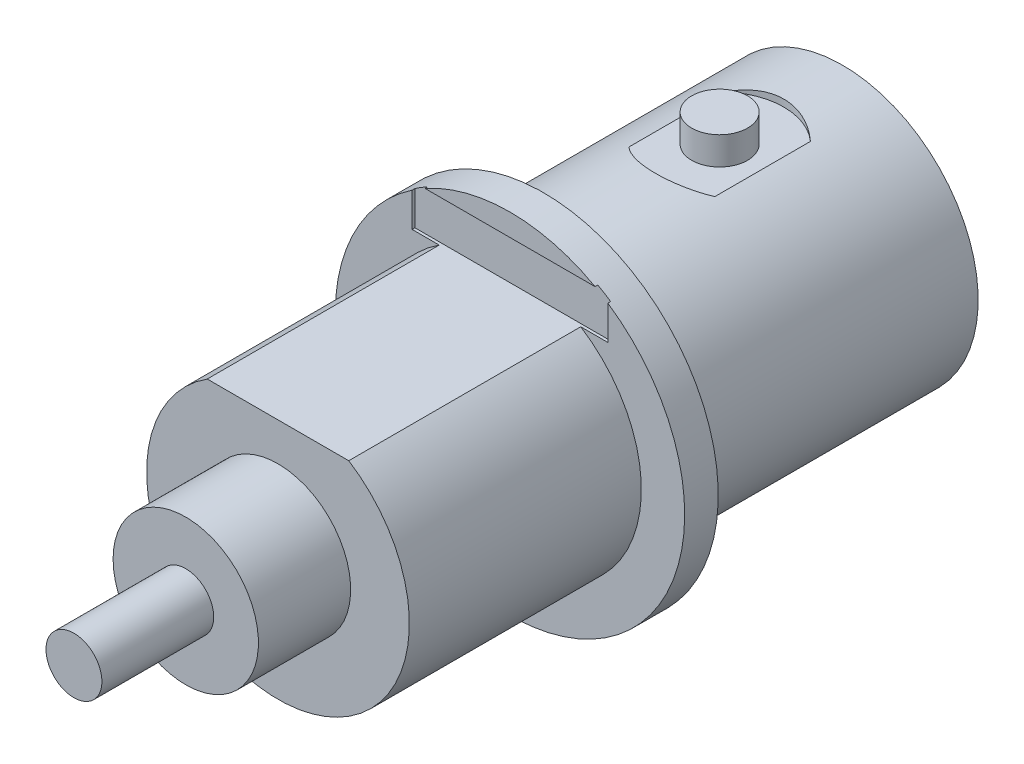
ISO-10303-21;
HEADER;
FILE_DESCRIPTION(('STEP AP214'),'2;1');
FILE_NAME('part.step','',(''),(''),'','','');
FILE_SCHEMA(('AUTOMOTIVE_DESIGN { 1 0 10303 214 1 1 1 1 }'));
ENDSEC;
DATA;
#1=APPLICATION_CONTEXT('core data for automotive mechanical design processes');
#2=APPLICATION_PROTOCOL_DEFINITION('international standard','automotive_design',2000,#1);
#3=PRODUCT_CONTEXT('',#1,'mechanical');
#4=PRODUCT('Part','Part','',(#3));
#5=PRODUCT_RELATED_PRODUCT_CATEGORY('part','',(#4));
#6=PRODUCT_DEFINITION_FORMATION('','',#4);
#7=PRODUCT_DEFINITION_CONTEXT('part definition',#1,'design');
#8=PRODUCT_DEFINITION('design','',#6,#7);
#9=PRODUCT_DEFINITION_SHAPE('','',#8);
#10=(LENGTH_UNIT() NAMED_UNIT(*) SI_UNIT(.MILLI.,.METRE.));
#11=(NAMED_UNIT(*) PLANE_ANGLE_UNIT() SI_UNIT($,.RADIAN.));
#12=(NAMED_UNIT(*) SI_UNIT($,.STERADIAN.) SOLID_ANGLE_UNIT());
#13=UNCERTAINTY_MEASURE_WITH_UNIT(LENGTH_MEASURE(1.E-05),#10,'distance_accuracy_value','');
#14=(GEOMETRIC_REPRESENTATION_CONTEXT(3) GLOBAL_UNCERTAINTY_ASSIGNED_CONTEXT((#13)) GLOBAL_UNIT_ASSIGNED_CONTEXT((#10,
#11,#12)) REPRESENTATION_CONTEXT('',''));
#15=CARTESIAN_POINT('',(0.,0.,0.));
#16=DIRECTION('',(0.,0.,1.));
#17=DIRECTION('',(1.,0.,0.));
#18=AXIS2_PLACEMENT_3D('',#15,#16,#17);
#19=CARTESIAN_POINT('',(0.,-4.6,4.4));
#20=DIRECTION('',(0.,-1.,0.));
#21=DIRECTION('',(-1.,0.,0.));
#22=AXIS2_PLACEMENT_3D('',#19,#20,#21);
#23=CYLINDRICAL_SURFACE('',#22,1.);
#24=CARTESIAN_POINT('',(0.,-5.6,4.4));
#25=DIRECTION('',(0.,1.,0.));
#26=DIRECTION('',(-1.,0.,0.));
#27=AXIS2_PLACEMENT_3D('',#24,#25,#26);
#28=CIRCLE('',#27,1.);
#29=CARTESIAN_POINT('',(-1.,-5.6,4.4));
#30=VERTEX_POINT('',#29);
#31=EDGE_CURVE('E11',#30,#30,#28,.T.);
#32=ORIENTED_EDGE('',*,*,#31,.T.);
#33=EDGE_LOOP('',(#32));
#34=FACE_BOUND('',#33,.T.);
#35=CARTESIAN_POINT('',(0.,-4.6,4.4));
#36=DIRECTION('',(0.,1.,0.));
#37=DIRECTION('',(-1.,0.,0.));
#38=AXIS2_PLACEMENT_3D('',#35,#36,#37);
#39=CIRCLE('',#38,1.);
#40=CARTESIAN_POINT('',(-1.,-4.6,4.4));
#41=VERTEX_POINT('',#40);
#42=EDGE_CURVE('E202',#41,#41,#39,.T.);
#43=ORIENTED_EDGE('',*,*,#42,.F.);
#44=EDGE_LOOP('',(#43));
#45=FACE_BOUND('',#44,.T.);
#46=ADVANCED_FACE('F17',(#34,#45),#23,.T.);
#47=CARTESIAN_POINT('',(0.,-5.6,4.4));
#48=DIRECTION('',(0.,1.,0.));
#49=DIRECTION('',(0.,0.,1.));
#50=AXIS2_PLACEMENT_3D('',#47,#48,#49);
#51=PLANE('',#50);
#52=ORIENTED_EDGE('',*,*,#31,.F.);
#53=EDGE_LOOP('',(#52));
#54=FACE_BOUND('',#53,.T.);
#55=ADVANCED_FACE('F331',(#54),#51,.F.);
#56=CARTESIAN_POINT('',(0.,4.6,4.4));
#57=DIRECTION('',(0.,1.,0.));
#58=DIRECTION('',(-1.,0.,0.));
#59=AXIS2_PLACEMENT_3D('',#56,#57,#58);
#60=CYLINDRICAL_SURFACE('',#59,1.);
#61=CARTESIAN_POINT('',(0.,5.6,4.4));
#62=DIRECTION('',(0.,-1.,0.));
#63=DIRECTION('',(-1.,0.,0.));
#64=AXIS2_PLACEMENT_3D('',#61,#62,#63);
#65=CIRCLE('',#64,1.);
#66=CARTESIAN_POINT('',(-1.,5.6,4.4));
#67=VERTEX_POINT('',#66);
#68=EDGE_CURVE('E31',#67,#67,#65,.T.);
#69=ORIENTED_EDGE('',*,*,#68,.T.);
#70=EDGE_LOOP('',(#69));
#71=FACE_BOUND('',#70,.T.);
#72=CARTESIAN_POINT('',(0.,4.6,4.4));
#73=DIRECTION('',(0.,-1.,0.));
#74=DIRECTION('',(-1.,0.,0.));
#75=AXIS2_PLACEMENT_3D('',#72,#73,#74);
#76=CIRCLE('',#75,1.);
#77=CARTESIAN_POINT('',(-1.,4.6,4.4));
#78=VERTEX_POINT('',#77);
#79=EDGE_CURVE('E211',#78,#78,#76,.T.);
#80=ORIENTED_EDGE('',*,*,#79,.F.);
#81=EDGE_LOOP('',(#80));
#82=FACE_BOUND('',#81,.T.);
#83=ADVANCED_FACE('F337',(#71,#82),#60,.T.);
#84=CARTESIAN_POINT('',(0.,5.6,4.4));
#85=DIRECTION('',(0.,-1.,0.));
#86=DIRECTION('',(0.,0.,-1.));
#87=AXIS2_PLACEMENT_3D('',#84,#85,#86);
#88=PLANE('',#87);
#89=ORIENTED_EDGE('',*,*,#68,.F.);
#90=EDGE_LOOP('',(#89));
#91=FACE_BOUND('',#90,.T.);
#92=ADVANCED_FACE('F343',(#91),#88,.F.);
#93=CARTESIAN_POINT('',(0.,-5.,4.4));
#94=DIRECTION('',(0.,1.,0.));
#95=DIRECTION('',(1.,0.,0.));
#96=AXIS2_PLACEMENT_3D('',#93,#94,#95);
#97=CYLINDRICAL_SURFACE('',#96,2.3);
#98=CARTESIAN_POINT('',(-1.53704261489394,-4.6,6.11099386322687));
#99=CARTESIAN_POINT('',(-1.4906298131567,-4.61550891309749,6.15268182455969));
#100=CARTESIAN_POINT('',(-1.44250589234814,-4.63080657242072,6.19250512185041));
#101=CARTESIAN_POINT('',(-1.34300705799123,-4.66063667431046,6.26822125569124));
#102=CARTESIAN_POINT('',(-1.29163088762436,-4.67516881702227,6.30411255792612));
#103=CARTESIAN_POINT('',(-1.13269629796707,-4.71714811789734,6.4056940005494));
#104=CARTESIAN_POINT('',(-1.02054507502494,-4.74290425891573,6.4650996222041));
#105=CARTESIAN_POINT('',(-0.786447672910064,-4.78729916609794,6.56512228438405));
#106=CARTESIAN_POINT('',(-0.664474254287195,-4.80591725219317,6.6056848042722));
#107=CARTESIAN_POINT('',(-0.414633540399089,-4.83387146918193,6.66595097481931));
#108=CARTESIAN_POINT('',(-0.286778229523473,-4.84322566888756,6.68569523548452));
#109=CARTESIAN_POINT('',(-0.0374878723374627,-4.85135615397962,6.70286857434512));
#110=CARTESIAN_POINT('',(0.0838353555363709,-4.8507701854694,6.70164299919057));
#111=CARTESIAN_POINT('',(0.32445743599385,-4.84063306663373,6.6802012795501));
#112=CARTESIAN_POINT('',(0.443755436573453,-4.83107823386259,6.65997733469097));
#113=CARTESIAN_POINT('',(0.673633655235687,-4.80434860687774,6.6022475960525));
#114=CARTESIAN_POINT('',(0.784362874325871,-4.78738865333914,6.56522797978869));
#115=CARTESIAN_POINT('',(0.998044777560692,-4.74744343575194,6.47541147263036));
#116=CARTESIAN_POINT('',(1.10099808851902,-4.72445865803183,6.4226158551388));
#117=CARTESIAN_POINT('',(1.25937247227696,-4.68405563714825,6.32587532828797));
#118=CARTESIAN_POINT('',(1.31786025605898,-4.66789084491859,6.28632138488218));
#119=CARTESIAN_POINT('',(1.43063030303366,-4.63457117644841,6.20228264866359));
#120=CARTESIAN_POINT('',(1.48492309675131,-4.61741898137366,6.15781093231778));
#121=CARTESIAN_POINT('',(1.53704261489394,-4.6,6.11099386322687));
#122=B_SPLINE_CURVE_WITH_KNOTS('',3,(#98,#99,#100,#101,#102,#103,#104,#105,#106,#107,#108,#109,
#110,#111,#112,#113,#114,#115,#116,#117,#118,#119,#120,#121),.UNSPECIFIED.,.F.,.F.,(4,2,2,2,2,2,
2,2,2,2,2,4),(0.,0.192751603086855,0.385578154429104,0.772109918951271,1.15975321368593,
1.54663892892574,1.90880212986845,2.27111409322923,2.62354853091461,2.97595452857423,
3.19298541062174,3.40945248248997),.UNSPECIFIED.);
#123=CARTESIAN_POINT('',(-1.53704261489394,-4.6,6.11099386322687));
#124=VERTEX_POINT('',#123);
#125=CARTESIAN_POINT('',(1.53704261489394,-4.6,6.11099386322687));
#126=VERTEX_POINT('',#125);
#127=EDGE_CURVE('E39',#124,#126,#122,.T.);
#128=ORIENTED_EDGE('',*,*,#127,.F.);
#129=CARTESIAN_POINT('',(0.,-4.6,4.4));
#130=DIRECTION('',(0.,-1.,0.));
#131=DIRECTION('',(1.,0.,0.));
#132=AXIS2_PLACEMENT_3D('',#129,#130,#131);
#133=CIRCLE('',#132,2.3);
#134=EDGE_CURVE('E189',#126,#124,#133,.T.);
#135=ORIENTED_EDGE('',*,*,#134,.F.);
#136=EDGE_LOOP('',(#128,#135));
#137=FACE_BOUND('',#136,.T.);
#138=ADVANCED_FACE('F221',(#137),#97,.F.);
#139=CARTESIAN_POINT('',(0.,-5.,4.4));
#140=DIRECTION('',(0.,1.,0.));
#141=DIRECTION('',(1.,0.,0.));
#142=AXIS2_PLACEMENT_3D('',#139,#140,#141);
#143=CYLINDRICAL_SURFACE('',#142,2.3);
#144=CARTESIAN_POINT('',(1.53704261489394,-4.6,2.68900613677313));
#145=CARTESIAN_POINT('',(1.4906298131567,-4.61550891309749,2.64731817544031));
#146=CARTESIAN_POINT('',(1.44250589234814,-4.63080657242072,2.60749487814959));
#147=CARTESIAN_POINT('',(1.34300705799123,-4.66063667431046,2.53177874430876));
#148=CARTESIAN_POINT('',(1.29163088762436,-4.67516881702227,2.49588744207388));
#149=CARTESIAN_POINT('',(1.13269629796707,-4.71714811789734,2.3943059994506));
#150=CARTESIAN_POINT('',(1.02054507502494,-4.74290425891573,2.3349003777959));
#151=CARTESIAN_POINT('',(0.786447672910065,-4.78729916609794,2.23487771561595));
#152=CARTESIAN_POINT('',(0.664474254287195,-4.80591725219317,2.1943151957278));
#153=CARTESIAN_POINT('',(0.414633540399089,-4.83387146918193,2.13404902518069));
#154=CARTESIAN_POINT('',(0.286778229523474,-4.84322566888756,2.11430476451548));
#155=CARTESIAN_POINT('',(0.0374878723374628,-4.85135615397962,2.09713142565488));
#156=CARTESIAN_POINT('',(-0.0838353555363708,-4.8507701854694,2.09835700080943));
#157=CARTESIAN_POINT('',(-0.324457435993849,-4.84063306663373,2.1197987204499));
#158=CARTESIAN_POINT('',(-0.443755436573453,-4.83107823386259,2.14002266530903));
#159=CARTESIAN_POINT('',(-0.673633655235686,-4.80434860687774,2.1977524039475));
#160=CARTESIAN_POINT('',(-0.784362874325871,-4.78738865333914,2.23477202021131));
#161=CARTESIAN_POINT('',(-0.998044777560692,-4.74744343575194,2.32458852736964));
#162=CARTESIAN_POINT('',(-1.10099808851902,-4.72445865803183,2.3773841448612));
#163=CARTESIAN_POINT('',(-1.25937247227696,-4.68405563714825,2.47412467171203));
#164=CARTESIAN_POINT('',(-1.31786025605898,-4.66789084491859,2.51367861511782));
#165=CARTESIAN_POINT('',(-1.43063030303366,-4.63457117644841,2.59771735133641));
#166=CARTESIAN_POINT('',(-1.48492309675131,-4.61741898137366,2.64218906768222));
#167=CARTESIAN_POINT('',(-1.53704261489394,-4.6,2.68900613677313));
#168=B_SPLINE_CURVE_WITH_KNOTS('',3,(#144,#145,#146,#147,#148,#149,#150,#151,#152,#153,#154,
#155,#156,#157,#158,#159,#160,#161,#162,#163,#164,#165,#166,#167),.UNSPECIFIED.,.F.,.F.,(4,2,2,
2,2,2,2,2,2,2,2,4),(0.,0.192751603086855,0.385578154429104,0.772109918951271,1.15975321368593,
1.54663892892574,1.90880212986845,2.27111409322923,2.62354853091461,2.97595452857423,
3.19298541062174,3.40945248248997),.UNSPECIFIED.);
#169=CARTESIAN_POINT('',(1.53704261489394,-4.6,2.68900613677313));
#170=VERTEX_POINT('',#169);
#171=CARTESIAN_POINT('',(-1.53704261489394,-4.6,2.68900613677313));
#172=VERTEX_POINT('',#171);
#173=EDGE_CURVE('E195',#170,#172,#168,.T.);
#174=ORIENTED_EDGE('',*,*,#173,.F.);
#175=CARTESIAN_POINT('',(0.,-4.6,4.4));
#176=DIRECTION('',(0.,-1.,0.));
#177=DIRECTION('',(1.,0.,0.));
#178=AXIS2_PLACEMENT_3D('',#175,#176,#177);
#179=CIRCLE('',#178,2.3);
#180=EDGE_CURVE('E191',#172,#170,#179,.T.);
#181=ORIENTED_EDGE('',*,*,#180,.F.);
#182=EDGE_LOOP('',(#174,#181));
#183=FACE_BOUND('',#182,.T.);
#184=ADVANCED_FACE('F350',(#183),#143,.F.);
#185=CARTESIAN_POINT('',(0.,-4.6,4.4));
#186=DIRECTION('',(0.,-1.,0.));
#187=DIRECTION('',(0.,0.,-1.));
#188=AXIS2_PLACEMENT_3D('',#185,#186,#187);
#189=PLANE('',#188);
#190=DIRECTION('',(0.,0.,-1.));
#191=VECTOR('',#190,1.);
#192=CARTESIAN_POINT('',(1.53704261489394,-4.6,6.11099386322687));
#193=LINE('',#192,#191);
#194=EDGE_CURVE('E197',#126,#170,#193,.T.);
#195=ORIENTED_EDGE('',*,*,#194,.F.);
#196=ORIENTED_EDGE('',*,*,#134,.T.);
#197=DIRECTION('',(0.,0.,1.));
#198=VECTOR('',#197,1.);
#199=CARTESIAN_POINT('',(-1.53704261489394,-4.6,2.68900613677313));
#200=LINE('',#199,#198);
#201=EDGE_CURVE('E192',#172,#124,#200,.T.);
#202=ORIENTED_EDGE('',*,*,#201,.F.);
#203=ORIENTED_EDGE('',*,*,#180,.T.);
#204=EDGE_LOOP('',(#195,#196,#202,#203));
#205=FACE_BOUND('',#204,.T.);
#206=ORIENTED_EDGE('',*,*,#42,.T.);
#207=EDGE_LOOP('',(#206));
#208=FACE_BOUND('',#207,.T.);
#209=ADVANCED_FACE('F243',(#205,#208),#189,.T.);
#210=CARTESIAN_POINT('',(0.,5.,4.4));
#211=DIRECTION('',(0.,-1.,0.));
#212=DIRECTION('',(1.,0.,0.));
#213=AXIS2_PLACEMENT_3D('',#210,#211,#212);
#214=CYLINDRICAL_SURFACE('',#213,2.3);
#215=CARTESIAN_POINT('',(1.53704261489394,4.6,6.11099386322687));
#216=CARTESIAN_POINT('',(1.4906298131567,4.61550891309749,6.15268182455969));
#217=CARTESIAN_POINT('',(1.44250589234814,4.63080657242072,6.19250512185042));
#218=CARTESIAN_POINT('',(1.34300705799123,4.66063667431046,6.26822125569124));
#219=CARTESIAN_POINT('',(1.29163088762436,4.67516881702227,6.30411255792612));
#220=CARTESIAN_POINT('',(1.13269629796707,4.71714811789734,6.4056940005494));
#221=CARTESIAN_POINT('',(1.02054507502494,4.74290425891572,6.4650996222041));
#222=CARTESIAN_POINT('',(0.786447672910064,4.78729916609794,6.56512228438405));
#223=CARTESIAN_POINT('',(0.664474254287194,4.80591725219317,6.6056848042722));
#224=CARTESIAN_POINT('',(0.414633540399088,4.83387146918193,6.66595097481931));
#225=CARTESIAN_POINT('',(0.286778229523473,4.84322566888756,6.68569523548452));
#226=CARTESIAN_POINT('',(0.0374878723374619,4.85135615397962,6.70286857434512));
#227=CARTESIAN_POINT('',(-0.0838353555363716,4.8507701854694,6.70164299919057));
#228=CARTESIAN_POINT('',(-0.32445743599385,4.84063306663373,6.6802012795501));
#229=CARTESIAN_POINT('',(-0.443755436573454,4.83107823386259,6.65997733469097));
#230=CARTESIAN_POINT('',(-0.673633655235687,4.80434860687774,6.6022475960525));
#231=CARTESIAN_POINT('',(-0.784362874325872,4.78738865333914,6.56522797978869));
#232=CARTESIAN_POINT('',(-0.998044777560693,4.74744343575194,6.47541147263036));
#233=CARTESIAN_POINT('',(-1.10099808851902,4.72445865803183,6.4226158551388));
#234=CARTESIAN_POINT('',(-1.25937247227696,4.68405563714825,6.32587532828797));
#235=CARTESIAN_POINT('',(-1.31786025605898,4.66789084491859,6.28632138488218));
#236=CARTESIAN_POINT('',(-1.43063030303366,4.63457117644841,6.20228264866359));
#237=CARTESIAN_POINT('',(-1.48492309675131,4.61741898137366,6.15781093231778));
#238=CARTESIAN_POINT('',(-1.53704261489394,4.6,6.11099386322687));
#239=B_SPLINE_CURVE_WITH_KNOTS('',3,(#215,#216,#217,#218,#219,#220,#221,#222,#223,#224,#225,
#226,#227,#228,#229,#230,#231,#232,#233,#234,#235,#236,#237,#238),.UNSPECIFIED.,.F.,.F.,(4,2,2,
2,2,2,2,2,2,2,2,4),(0.,0.192751603086855,0.385578154429103,0.772109918951271,1.15975321368593,
1.54663892892574,1.90880212986845,2.27111409322923,2.62354853091461,2.97595452857423,
3.19298541062174,3.40945248248997),.UNSPECIFIED.);
#240=CARTESIAN_POINT('',(1.53704261489394,4.6,6.11099386322687));
#241=VERTEX_POINT('',#240);
#242=CARTESIAN_POINT('',(-1.53704261489394,4.6,6.11099386322687));
#243=VERTEX_POINT('',#242);
#244=EDGE_CURVE('E196',#241,#243,#239,.T.);
#245=ORIENTED_EDGE('',*,*,#244,.F.);
#246=CARTESIAN_POINT('',(0.,4.6,4.4));
#247=DIRECTION('',(0.,1.,0.));
#248=DIRECTION('',(1.,0.,0.));
#249=AXIS2_PLACEMENT_3D('',#246,#247,#248);
#250=CIRCLE('',#249,2.3);
#251=EDGE_CURVE('E203',#243,#241,#250,.T.);
#252=ORIENTED_EDGE('',*,*,#251,.F.);
#253=EDGE_LOOP('',(#245,#252));
#254=FACE_BOUND('',#253,.T.);
#255=ADVANCED_FACE('F238',(#254),#214,.F.);
#256=CARTESIAN_POINT('',(0.,5.,4.4));
#257=DIRECTION('',(0.,-1.,0.));
#258=DIRECTION('',(1.,0.,0.));
#259=AXIS2_PLACEMENT_3D('',#256,#257,#258);
#260=CYLINDRICAL_SURFACE('',#259,2.3);
#261=CARTESIAN_POINT('',(-1.53704261489394,4.6,2.68900613677313));
#262=CARTESIAN_POINT('',(-1.4906298131567,4.61550891309749,2.64731817544031));
#263=CARTESIAN_POINT('',(-1.44250589234814,4.63080657242072,2.60749487814959));
#264=CARTESIAN_POINT('',(-1.34300705799123,4.66063667431046,2.53177874430876));
#265=CARTESIAN_POINT('',(-1.29163088762436,4.67516881702227,2.49588744207388));
#266=CARTESIAN_POINT('',(-1.13269629796707,4.71714811789733,2.3943059994506));
#267=CARTESIAN_POINT('',(-1.02054507502494,4.74290425891572,2.3349003777959));
#268=CARTESIAN_POINT('',(-0.786447672910064,4.78729916609794,2.23487771561596));
#269=CARTESIAN_POINT('',(-0.664474254287195,4.80591725219317,2.1943151957278));
#270=CARTESIAN_POINT('',(-0.414633540399088,4.83387146918193,2.13404902518069));
#271=CARTESIAN_POINT('',(-0.286778229523473,4.84322566888756,2.11430476451548));
#272=CARTESIAN_POINT('',(-0.0374878723374624,4.85135615397962,2.09713142565488));
#273=CARTESIAN_POINT('',(0.0838353555363711,4.8507701854694,2.09835700080943));
#274=CARTESIAN_POINT('',(0.32445743599385,4.84063306663373,2.1197987204499));
#275=CARTESIAN_POINT('',(0.443755436573453,4.83107823386259,2.14002266530903));
#276=CARTESIAN_POINT('',(0.673633655235687,4.80434860687774,2.1977524039475));
#277=CARTESIAN_POINT('',(0.784362874325871,4.78738865333914,2.23477202021131));
#278=CARTESIAN_POINT('',(0.998044777560692,4.74744343575194,2.32458852736964));
#279=CARTESIAN_POINT('',(1.10099808851902,4.72445865803183,2.3773841448612));
#280=CARTESIAN_POINT('',(1.25937247227695,4.68405563714825,2.47412467171203));
#281=CARTESIAN_POINT('',(1.31786025605898,4.66789084491859,2.51367861511782));
#282=CARTESIAN_POINT('',(1.43063030303366,4.63457117644841,2.59771735133641));
#283=CARTESIAN_POINT('',(1.48492309675131,4.61741898137366,2.64218906768222));
#284=CARTESIAN_POINT('',(1.53704261489394,4.6,2.68900613677313));
#285=B_SPLINE_CURVE_WITH_KNOTS('',3,(#261,#262,#263,#264,#265,#266,#267,#268,#269,#270,#271,
#272,#273,#274,#275,#276,#277,#278,#279,#280,#281,#282,#283,#284),.UNSPECIFIED.,.F.,.F.,(4,2,2,
2,2,2,2,2,2,2,2,4),(0.,0.192751603086855,0.385578154429104,0.772109918951271,1.15975321368593,
1.54663892892574,1.90880212986845,2.27111409322923,2.62354853091461,2.97595452857423,
3.19298541062174,3.40945248248997),.UNSPECIFIED.);
#286=CARTESIAN_POINT('',(-1.53704261489394,4.6,2.68900613677314));
#287=VERTEX_POINT('',#286);
#288=CARTESIAN_POINT('',(1.53704261489394,4.6,2.68900613677314));
#289=VERTEX_POINT('',#288);
#290=EDGE_CURVE('E21',#287,#289,#285,.T.);
#291=ORIENTED_EDGE('',*,*,#290,.F.);
#292=CARTESIAN_POINT('',(0.,4.6,4.4));
#293=DIRECTION('',(0.,1.,0.));
#294=DIRECTION('',(1.,0.,0.));
#295=AXIS2_PLACEMENT_3D('',#292,#293,#294);
#296=CIRCLE('',#295,2.3);
#297=EDGE_CURVE('E206',#289,#287,#296,.T.);
#298=ORIENTED_EDGE('',*,*,#297,.F.);
#299=EDGE_LOOP('',(#291,#298));
#300=FACE_BOUND('',#299,.T.);
#301=ADVANCED_FACE('F242',(#300),#260,.F.);
#302=CARTESIAN_POINT('',(0.,4.6,4.4));
#303=DIRECTION('',(0.,-1.,0.));
#304=DIRECTION('',(0.,0.,-1.));
#305=AXIS2_PLACEMENT_3D('',#302,#303,#304);
#306=PLANE('',#305);
#307=DIRECTION('',(0.,0.,-1.));
#308=VECTOR('',#307,1.);
#309=CARTESIAN_POINT('',(-1.53704261489394,4.6,6.11099386322687));
#310=LINE('',#309,#308);
#311=EDGE_CURVE('E208',#243,#287,#310,.T.);
#312=ORIENTED_EDGE('',*,*,#311,.F.);
#313=ORIENTED_EDGE('',*,*,#251,.T.);
#314=DIRECTION('',(0.,0.,1.));
#315=VECTOR('',#314,1.);
#316=CARTESIAN_POINT('',(1.53704261489394,4.6,2.68900613677313));
#317=LINE('',#316,#315);
#318=EDGE_CURVE('E188',#289,#241,#317,.T.);
#319=ORIENTED_EDGE('',*,*,#318,.F.);
#320=ORIENTED_EDGE('',*,*,#297,.T.);
#321=EDGE_LOOP('',(#312,#313,#319,#320));
#322=FACE_BOUND('',#321,.T.);
#323=ORIENTED_EDGE('',*,*,#79,.T.);
#324=EDGE_LOOP('',(#323));
#325=FACE_BOUND('',#324,.T.);
#326=ADVANCED_FACE('F248',(#322,#325),#306,.F.);
#327=CARTESIAN_POINT('',(-3.5,3.96,20.2));
#328=DIRECTION('',(0.,-1.,0.));
#329=DIRECTION('',(0.,0.,-1.));
#330=AXIS2_PLACEMENT_3D('',#327,#328,#329);
#331=PLANE('',#330);
#332=DIRECTION('',(0.,0.,-1.));
#333=VECTOR('',#332,1.);
#334=CARTESIAN_POINT('',(-2.53148177951175,3.96,20.2));
#335=LINE('',#334,#333);
#336=CARTESIAN_POINT('',(-2.53148177951175,3.96,20.2));
#337=VERTEX_POINT('',#336);
#338=CARTESIAN_POINT('',(-2.53148177951175,3.96,11.9));
#339=VERTEX_POINT('',#338);
#340=EDGE_CURVE('E358',#337,#339,#335,.T.);
#341=ORIENTED_EDGE('',*,*,#340,.F.);
#342=DIRECTION('',(-1.,0.,0.));
#343=VECTOR('',#342,1.);
#344=CARTESIAN_POINT('',(2.53148177951175,3.96,20.2));
#345=LINE('',#344,#343);
#346=CARTESIAN_POINT('',(2.53148177951175,3.96,20.2));
#347=VERTEX_POINT('',#346);
#348=EDGE_CURVE('E73',#347,#337,#345,.T.);
#349=ORIENTED_EDGE('',*,*,#348,.F.);
#350=DIRECTION('',(0.,0.,1.));
#351=VECTOR('',#350,1.);
#352=CARTESIAN_POINT('',(2.53148177951175,3.96,11.9));
#353=LINE('',#352,#351);
#354=CARTESIAN_POINT('',(2.53148177951175,3.96,11.9));
#355=VERTEX_POINT('',#354);
#356=EDGE_CURVE('E362',#355,#347,#353,.T.);
#357=ORIENTED_EDGE('',*,*,#356,.F.);
#358=DIRECTION('',(-1.,0.,0.));
#359=VECTOR('',#358,1.);
#360=CARTESIAN_POINT('',(3.5,3.96,11.9));
#361=LINE('',#360,#359);
#362=CARTESIAN_POINT('',(3.5,3.96,11.9));
#363=VERTEX_POINT('',#362);
#364=EDGE_CURVE('E133',#363,#355,#361,.T.);
#365=ORIENTED_EDGE('',*,*,#364,.F.);
#366=DIRECTION('',(0.,0.,-1.));
#367=VECTOR('',#366,1.);
#368=CARTESIAN_POINT('',(3.5,3.96,11.9));
#369=LINE('',#368,#367);
#370=CARTESIAN_POINT('',(3.5,3.96,11.8));
#371=VERTEX_POINT('',#370);
#372=EDGE_CURVE('E129',#363,#371,#369,.T.);
#373=ORIENTED_EDGE('',*,*,#372,.T.);
#374=DIRECTION('',(1.,0.,0.));
#375=VECTOR('',#374,1.);
#376=CARTESIAN_POINT('',(-3.5,3.96,11.8));
#377=LINE('',#376,#375);
#378=CARTESIAN_POINT('',(-3.5,3.96,11.8));
#379=VERTEX_POINT('',#378);
#380=EDGE_CURVE('E370',#379,#371,#377,.T.);
#381=ORIENTED_EDGE('',*,*,#380,.F.);
#382=DIRECTION('',(0.,0.,-1.));
#383=VECTOR('',#382,1.);
#384=CARTESIAN_POINT('',(-3.5,3.96,11.9));
#385=LINE('',#384,#383);
#386=CARTESIAN_POINT('',(-3.5,3.96,11.9));
#387=VERTEX_POINT('',#386);
#388=EDGE_CURVE('E369',#387,#379,#385,.T.);
#389=ORIENTED_EDGE('',*,*,#388,.F.);
#390=DIRECTION('',(-1.,0.,0.));
#391=VECTOR('',#390,1.);
#392=CARTESIAN_POINT('',(-2.53148177951175,3.96,11.9));
#393=LINE('',#392,#391);
#394=EDGE_CURVE('E144',#339,#387,#393,.T.);
#395=ORIENTED_EDGE('',*,*,#394,.F.);
#396=EDGE_LOOP('',(#341,#349,#357,#365,#373,#381,#389,#395));
#397=FACE_BOUND('',#396,.T.);
#398=ADVANCED_FACE('F251',(#397),#331,.F.);
#399=CARTESIAN_POINT('',(-3.5,5.46,20.2));
#400=DIRECTION('',(-1.,0.,0.));
#401=DIRECTION('',(0.,0.,1.));
#402=AXIS2_PLACEMENT_3D('',#399,#400,#401);
#403=PLANE('',#402);
#404=DIRECTION('',(0.,1.,0.));
#405=VECTOR('',#404,1.);
#406=CARTESIAN_POINT('',(-3.5,3.96,11.9));
#407=LINE('',#406,#405);
#408=CARTESIAN_POINT('',(-3.5,5.17807879430199,11.9));
#409=VERTEX_POINT('',#408);
#410=EDGE_CURVE('E132',#387,#409,#407,.T.);
#411=ORIENTED_EDGE('',*,*,#410,.F.);
#412=ORIENTED_EDGE('',*,*,#388,.T.);
#413=DIRECTION('',(0.,-1.,0.));
#414=VECTOR('',#413,1.);
#415=CARTESIAN_POINT('',(-3.5,5.17807879430199,11.8));
#416=LINE('',#415,#414);
#417=CARTESIAN_POINT('',(-3.5,5.17807879430199,11.8));
#418=VERTEX_POINT('',#417);
#419=EDGE_CURVE('E372',#418,#379,#416,.T.);
#420=ORIENTED_EDGE('',*,*,#419,.F.);
#421=DIRECTION('',(0.,0.,-1.));
#422=VECTOR('',#421,1.);
#423=CARTESIAN_POINT('',(-3.5,5.17807879430199,11.9));
#424=LINE('',#423,#422);
#425=EDGE_CURVE('E380',#409,#418,#424,.T.);
#426=ORIENTED_EDGE('',*,*,#425,.F.);
#427=EDGE_LOOP('',(#411,#412,#420,#426));
#428=FACE_BOUND('',#427,.T.);
#429=ADVANCED_FACE('F255',(#428),#403,.F.);
#430=CARTESIAN_POINT('',(3.5,5.46,20.2));
#431=DIRECTION('',(0.,1.,0.));
#432=DIRECTION('',(0.,0.,1.));
#433=AXIS2_PLACEMENT_3D('',#430,#431,#432);
#434=PLANE('',#433);
#435=DIRECTION('',(0.,0.,1.));
#436=VECTOR('',#435,1.);
#437=CARTESIAN_POINT('',(-3.04152922063885,5.46,11.8));
#438=LINE('',#437,#436);
#439=CARTESIAN_POINT('',(-3.04152922063885,5.46,11.8));
#440=VERTEX_POINT('',#439);
#441=CARTESIAN_POINT('',(-3.04152922063885,5.46,11.9));
#442=VERTEX_POINT('',#441);
#443=EDGE_CURVE('E383',#440,#442,#438,.T.);
#444=ORIENTED_EDGE('',*,*,#443,.F.);
#445=DIRECTION('',(-1.,0.,0.));
#446=VECTOR('',#445,1.);
#447=CARTESIAN_POINT('',(3.04152922063885,5.46,11.8));
#448=LINE('',#447,#446);
#449=CARTESIAN_POINT('',(3.04152922063885,5.46,11.8));
#450=VERTEX_POINT('',#449);
#451=EDGE_CURVE('E361',#450,#440,#448,.T.);
#452=ORIENTED_EDGE('',*,*,#451,.F.);
#453=DIRECTION('',(0.,0.,-1.));
#454=VECTOR('',#453,1.);
#455=CARTESIAN_POINT('',(3.04152922063885,5.46,11.9));
#456=LINE('',#455,#454);
#457=CARTESIAN_POINT('',(3.04152922063885,5.46,11.9));
#458=VERTEX_POINT('',#457);
#459=EDGE_CURVE('E388',#458,#450,#456,.T.);
#460=ORIENTED_EDGE('',*,*,#459,.F.);
#461=DIRECTION('',(1.,0.,0.));
#462=VECTOR('',#461,1.);
#463=CARTESIAN_POINT('',(-3.04152922063885,5.46,11.9));
#464=LINE('',#463,#462);
#465=EDGE_CURVE('E142',#442,#458,#464,.T.);
#466=ORIENTED_EDGE('',*,*,#465,.F.);
#467=EDGE_LOOP('',(#444,#452,#460,#466));
#468=FACE_BOUND('',#467,.T.);
#469=ADVANCED_FACE('F259',(#468),#434,.F.);
#470=CARTESIAN_POINT('',(0.,4.71,11.8));
#471=DIRECTION('',(0.,0.,1.));
#472=DIRECTION('',(1.,0.,0.));
#473=AXIS2_PLACEMENT_3D('',#470,#471,#472);
#474=PLANE('',#473);
#475=CARTESIAN_POINT('',(0.,0.,11.8));
#476=DIRECTION('',(0.,0.,-1.));
#477=DIRECTION('',(-1.,0.,0.));
#478=AXIS2_PLACEMENT_3D('',#475,#476,#477);
#479=CIRCLE('',#478,6.25);
#480=EDGE_CURVE('E382',#418,#440,#479,.T.);
#481=ORIENTED_EDGE('',*,*,#480,.F.);
#482=ORIENTED_EDGE('',*,*,#419,.T.);
#483=ORIENTED_EDGE('',*,*,#380,.T.);
#484=DIRECTION('',(0.,1.,0.));
#485=VECTOR('',#484,1.);
#486=CARTESIAN_POINT('',(3.5,3.96,11.8));
#487=LINE('',#486,#485);
#488=CARTESIAN_POINT('',(3.5,5.17807879430199,11.8));
#489=VERTEX_POINT('',#488);
#490=EDGE_CURVE('E373',#371,#489,#487,.T.);
#491=ORIENTED_EDGE('',*,*,#490,.T.);
#492=CARTESIAN_POINT('',(0.,0.,11.8));
#493=DIRECTION('',(0.,0.,-1.));
#494=DIRECTION('',(-1.,0.,0.));
#495=AXIS2_PLACEMENT_3D('',#492,#493,#494);
#496=CIRCLE('',#495,6.25);
#497=EDGE_CURVE('E117',#450,#489,#496,.T.);
#498=ORIENTED_EDGE('',*,*,#497,.F.);
#499=ORIENTED_EDGE('',*,*,#451,.T.);
#500=EDGE_LOOP('',(#481,#482,#483,#491,#498,#499));
#501=FACE_BOUND('',#500,.T.);
#502=ADVANCED_FACE('F263',(#501),#474,.T.);
#503=CARTESIAN_POINT('',(3.5,3.96,20.2));
#504=DIRECTION('',(1.,0.,0.));
#505=DIRECTION('',(0.,0.,-1.));
#506=AXIS2_PLACEMENT_3D('',#503,#504,#505);
#507=PLANE('',#506);
#508=DIRECTION('',(0.,-1.,0.));
#509=VECTOR('',#508,1.);
#510=CARTESIAN_POINT('',(3.5,5.17807879430199,11.9));
#511=LINE('',#510,#509);
#512=CARTESIAN_POINT('',(3.5,5.17807879430199,11.9));
#513=VERTEX_POINT('',#512);
#514=EDGE_CURVE('E124',#513,#363,#511,.T.);
#515=ORIENTED_EDGE('',*,*,#514,.F.);
#516=DIRECTION('',(0.,0.,1.));
#517=VECTOR('',#516,1.);
#518=CARTESIAN_POINT('',(3.5,5.17807879430199,11.8));
#519=LINE('',#518,#517);
#520=EDGE_CURVE('E127',#489,#513,#519,.T.);
#521=ORIENTED_EDGE('',*,*,#520,.F.);
#522=ORIENTED_EDGE('',*,*,#490,.F.);
#523=ORIENTED_EDGE('',*,*,#372,.F.);
#524=EDGE_LOOP('',(#515,#521,#522,#523));
#525=FACE_BOUND('',#524,.T.);
#526=ADVANCED_FACE('F125',(#525),#507,.F.);
#527=CARTESIAN_POINT('',(0.,0.,11.9));
#528=DIRECTION('',(0.,0.,1.));
#529=DIRECTION('',(-1.,0.,0.));
#530=AXIS2_PLACEMENT_3D('',#527,#528,#529);
#531=CYLINDRICAL_SURFACE('',#530,4.7);
#532=ORIENTED_EDGE('',*,*,#340,.T.);
#533=CARTESIAN_POINT('',(0.,0.,11.9));
#534=DIRECTION('',(0.,0.,-1.));
#535=DIRECTION('',(-1.,0.,0.));
#536=AXIS2_PLACEMENT_3D('',#533,#534,#535);
#537=CIRCLE('',#536,4.7);
#538=EDGE_CURVE('E153',#355,#339,#537,.T.);
#539=ORIENTED_EDGE('',*,*,#538,.F.);
#540=ORIENTED_EDGE('',*,*,#356,.T.);
#541=CARTESIAN_POINT('',(0.,0.,20.2));
#542=DIRECTION('',(0.,0.,-1.));
#543=DIRECTION('',(-1.,0.,0.));
#544=AXIS2_PLACEMENT_3D('',#541,#542,#543);
#545=CIRCLE('',#544,4.7);
#546=EDGE_CURVE('E366',#347,#337,#545,.T.);
#547=ORIENTED_EDGE('',*,*,#546,.T.);
#548=EDGE_LOOP('',(#532,#539,#540,#547));
#549=FACE_BOUND('',#548,.T.);
#550=ADVANCED_FACE('F270',(#549),#531,.T.);
#551=CARTESIAN_POINT('',(0.,0.,10.7));
#552=DIRECTION('',(0.,0.,1.));
#553=DIRECTION('',(-1.,0.,0.));
#554=AXIS2_PLACEMENT_3D('',#551,#552,#553);
#555=CYLINDRICAL_SURFACE('',#554,6.25);
#556=CARTESIAN_POINT('',(0.,0.,10.7));
#557=DIRECTION('',(0.,0.,-1.));
#558=DIRECTION('',(-1.,0.,0.));
#559=AXIS2_PLACEMENT_3D('',#556,#557,#558);
#560=CIRCLE('',#559,6.25);
#561=CARTESIAN_POINT('',(-6.25,0.,10.7));
#562=VERTEX_POINT('',#561);
#563=EDGE_CURVE('E182',#562,#562,#560,.T.);
#564=ORIENTED_EDGE('',*,*,#563,.F.);
#565=EDGE_LOOP('',(#564));
#566=FACE_BOUND('',#565,.T.);
#567=ORIENTED_EDGE('',*,*,#425,.T.);
#568=ORIENTED_EDGE('',*,*,#480,.T.);
#569=ORIENTED_EDGE('',*,*,#443,.T.);
#570=CARTESIAN_POINT('',(0.,0.,11.9));
#571=DIRECTION('',(0.,0.,-1.));
#572=DIRECTION('',(-1.,0.,0.));
#573=AXIS2_PLACEMENT_3D('',#570,#571,#572);
#574=CIRCLE('',#573,6.25);
#575=EDGE_CURVE('E148',#442,#458,#574,.T.);
#576=ORIENTED_EDGE('',*,*,#575,.T.);
#577=ORIENTED_EDGE('',*,*,#459,.T.);
#578=ORIENTED_EDGE('',*,*,#497,.T.);
#579=ORIENTED_EDGE('',*,*,#520,.T.);
#580=CARTESIAN_POINT('',(0.,0.,11.9));
#581=DIRECTION('',(0.,0.,-1.));
#582=DIRECTION('',(-1.,0.,0.));
#583=AXIS2_PLACEMENT_3D('',#580,#581,#582);
#584=CIRCLE('',#583,6.25);
#585=EDGE_CURVE('E137',#513,#409,#584,.T.);
#586=ORIENTED_EDGE('',*,*,#585,.T.);
#587=EDGE_LOOP('',(#567,#568,#569,#576,#577,#578,#579,#586));
#588=FACE_BOUND('',#587,.T.);
#589=ADVANCED_FACE('F136',(#566,#588),#555,.T.);
#590=CARTESIAN_POINT('',(0.,0.,11.9));
#591=DIRECTION('',(0.,0.,-1.));
#592=DIRECTION('',(-1.,0.,0.));
#593=AXIS2_PLACEMENT_3D('',#590,#591,#592);
#594=PLANE('',#593);
#595=ORIENTED_EDGE('',*,*,#465,.T.);
#596=ORIENTED_EDGE('',*,*,#575,.F.);
#597=EDGE_LOOP('',(#595,#596));
#598=FACE_BOUND('',#597,.T.);
#599=ADVANCED_FACE('F276',(#598),#594,.F.);
#600=CARTESIAN_POINT('',(0.,0.,11.9));
#601=DIRECTION('',(0.,0.,-1.));
#602=DIRECTION('',(-1.,0.,0.));
#603=AXIS2_PLACEMENT_3D('',#600,#601,#602);
#604=PLANE('',#603);
#605=ORIENTED_EDGE('',*,*,#394,.T.);
#606=ORIENTED_EDGE('',*,*,#410,.T.);
#607=ORIENTED_EDGE('',*,*,#585,.F.);
#608=ORIENTED_EDGE('',*,*,#514,.T.);
#609=ORIENTED_EDGE('',*,*,#364,.T.);
#610=ORIENTED_EDGE('',*,*,#538,.T.);
#611=EDGE_LOOP('',(#605,#606,#607,#608,#609,#610));
#612=FACE_BOUND('',#611,.T.);
#613=ADVANCED_FACE('F139',(#612),#604,.F.);
#614=CARTESIAN_POINT('',(0.,0.,3.2));
#615=DIRECTION('',(0.,0.,1.));
#616=DIRECTION('',(1.,0.,0.));
#617=AXIS2_PLACEMENT_3D('',#614,#615,#616);
#618=CYLINDRICAL_SURFACE('',#617,0.75);
#619=CARTESIAN_POINT('',(0.,0.,8.4));
#620=DIRECTION('',(0.,0.,-1.));
#621=DIRECTION('',(1.,0.,0.));
#622=AXIS2_PLACEMENT_3D('',#619,#620,#621);
#623=CIRCLE('',#622,0.75);
#624=CARTESIAN_POINT('',(0.75,0.,8.4));
#625=VERTEX_POINT('',#624);
#626=EDGE_CURVE('E150',#625,#625,#623,.T.);
#627=ORIENTED_EDGE('',*,*,#626,.F.);
#628=EDGE_LOOP('',(#627));
#629=FACE_BOUND('',#628,.T.);
#630=CARTESIAN_POINT('',(0.,0.,3.2));
#631=DIRECTION('',(0.,0.,1.));
#632=DIRECTION('',(1.,0.,0.));
#633=AXIS2_PLACEMENT_3D('',#630,#631,#632);
#634=CIRCLE('',#633,0.75);
#635=CARTESIAN_POINT('',(0.75,0.,3.2));
#636=VERTEX_POINT('',#635);
#637=EDGE_CURVE('E155',#636,#636,#634,.T.);
#638=ORIENTED_EDGE('',*,*,#637,.F.);
#639=EDGE_LOOP('',(#638));
#640=FACE_BOUND('',#639,.T.);
#641=ADVANCED_FACE('F283',(#629,#640),#618,.F.);
#642=CARTESIAN_POINT('',(0.,0.,8.4));
#643=DIRECTION('',(0.,0.,1.));
#644=DIRECTION('',(1.,0.,0.));
#645=AXIS2_PLACEMENT_3D('',#642,#643,#644);
#646=PLANE('',#645);
#647=ORIENTED_EDGE('',*,*,#626,.T.);
#648=EDGE_LOOP('',(#647));
#649=FACE_BOUND('',#648,.T.);
#650=ADVANCED_FACE('F286',(#649),#646,.F.);
#651=CARTESIAN_POINT('',(0.,0.,8.4));
#652=DIRECTION('',(0.,0.,-1.));
#653=DIRECTION('',(1.,0.,0.));
#654=AXIS2_PLACEMENT_3D('',#651,#652,#653);
#655=CYLINDRICAL_SURFACE('',#654,2.5);
#656=CARTESIAN_POINT('',(0.,0.,3.2));
#657=DIRECTION('',(0.,0.,1.));
#658=DIRECTION('',(1.,0.,0.));
#659=AXIS2_PLACEMENT_3D('',#656,#657,#658);
#660=CIRCLE('',#659,2.5);
#661=CARTESIAN_POINT('',(2.5,0.,3.2));
#662=VERTEX_POINT('',#661);
#663=EDGE_CURVE('E154',#662,#662,#660,.T.);
#664=ORIENTED_EDGE('',*,*,#663,.T.);
#665=EDGE_LOOP('',(#664));
#666=FACE_BOUND('',#665,.T.);
#667=CARTESIAN_POINT('',(0.,0.,8.4));
#668=DIRECTION('',(0.,0.,1.));
#669=DIRECTION('',(1.,0.,0.));
#670=AXIS2_PLACEMENT_3D('',#667,#668,#669);
#671=CIRCLE('',#670,2.5);
#672=CARTESIAN_POINT('',(2.5,0.,8.4));
#673=VERTEX_POINT('',#672);
#674=EDGE_CURVE('E161',#673,#673,#671,.T.);
#675=ORIENTED_EDGE('',*,*,#674,.F.);
#676=EDGE_LOOP('',(#675));
#677=FACE_BOUND('',#676,.T.);
#678=ADVANCED_FACE('F290',(#666,#677),#655,.T.);
#679=CARTESIAN_POINT('',(0.,0.,3.2));
#680=DIRECTION('',(0.,0.,1.));
#681=DIRECTION('',(1.,0.,0.));
#682=AXIS2_PLACEMENT_3D('',#679,#680,#681);
#683=PLANE('',#682);
#684=ORIENTED_EDGE('',*,*,#663,.F.);
#685=EDGE_LOOP('',(#684));
#686=FACE_BOUND('',#685,.T.);
#687=ORIENTED_EDGE('',*,*,#637,.T.);
#688=EDGE_LOOP('',(#687));
#689=FACE_BOUND('',#688,.T.);
#690=ADVANCED_FACE('F294',(#686,#689),#683,.F.);
#691=CARTESIAN_POINT('',(0.,0.,0.));
#692=DIRECTION('',(0.,0.,1.));
#693=DIRECTION('',(1.,0.,0.));
#694=AXIS2_PLACEMENT_3D('',#691,#692,#693);
#695=CYLINDRICAL_SURFACE('',#694,4.15);
#696=CARTESIAN_POINT('',(0.,0.,8.4));
#697=DIRECTION('',(0.,0.,-1.));
#698=DIRECTION('',(1.,0.,0.));
#699=AXIS2_PLACEMENT_3D('',#696,#697,#698);
#700=CIRCLE('',#699,4.15);
#701=CARTESIAN_POINT('',(4.15,0.,8.4));
#702=VERTEX_POINT('',#701);
#703=EDGE_CURVE('E158',#702,#702,#700,.T.);
#704=ORIENTED_EDGE('',*,*,#703,.F.);
#705=EDGE_LOOP('',(#704));
#706=FACE_BOUND('',#705,.T.);
#707=CARTESIAN_POINT('',(0.,0.,0.));
#708=DIRECTION('',(0.,0.,1.));
#709=DIRECTION('',(1.,0.,0.));
#710=AXIS2_PLACEMENT_3D('',#707,#708,#709);
#711=CIRCLE('',#710,4.15);
#712=CARTESIAN_POINT('',(4.15,0.,0.));
#713=VERTEX_POINT('',#712);
#714=EDGE_CURVE('E167',#713,#713,#711,.T.);
#715=ORIENTED_EDGE('',*,*,#714,.F.);
#716=EDGE_LOOP('',(#715));
#717=FACE_BOUND('',#716,.T.);
#718=ADVANCED_FACE('F298',(#706,#717),#695,.F.);
#719=CARTESIAN_POINT('',(0.,0.,8.4));
#720=DIRECTION('',(0.,0.,1.));
#721=DIRECTION('',(1.,0.,0.));
#722=AXIS2_PLACEMENT_3D('',#719,#720,#721);
#723=PLANE('',#722);
#724=ORIENTED_EDGE('',*,*,#703,.T.);
#725=EDGE_LOOP('',(#724));
#726=FACE_BOUND('',#725,.T.);
#727=ORIENTED_EDGE('',*,*,#674,.T.);
#728=EDGE_LOOP('',(#727));
#729=FACE_BOUND('',#728,.T.);
#730=ADVANCED_FACE('F302',(#726,#729),#723,.F.);
#731=CARTESIAN_POINT('',(0.,0.,23.5));
#732=DIRECTION('',(0.,0.,1.));
#733=DIRECTION('',(-1.,0.,0.));
#734=AXIS2_PLACEMENT_3D('',#731,#732,#733);
#735=CYLINDRICAL_SURFACE('',#734,1.);
#736=CARTESIAN_POINT('',(0.,0.,27.5));
#737=DIRECTION('',(0.,0.,-1.));
#738=DIRECTION('',(-1.,0.,0.));
#739=AXIS2_PLACEMENT_3D('',#736,#737,#738);
#740=CIRCLE('',#739,1.);
#741=CARTESIAN_POINT('',(-1.,0.,27.5));
#742=VERTEX_POINT('',#741);
#743=EDGE_CURVE('E164',#742,#742,#740,.T.);
#744=ORIENTED_EDGE('',*,*,#743,.T.);
#745=EDGE_LOOP('',(#744));
#746=FACE_BOUND('',#745,.T.);
#747=CARTESIAN_POINT('',(0.,0.,23.5));
#748=DIRECTION('',(0.,0.,-1.));
#749=DIRECTION('',(-1.,0.,0.));
#750=AXIS2_PLACEMENT_3D('',#747,#748,#749);
#751=CIRCLE('',#750,1.);
#752=CARTESIAN_POINT('',(-1.,0.,23.5));
#753=VERTEX_POINT('',#752);
#754=EDGE_CURVE('E174',#753,#753,#751,.T.);
#755=ORIENTED_EDGE('',*,*,#754,.F.);
#756=EDGE_LOOP('',(#755));
#757=FACE_BOUND('',#756,.T.);
#758=ADVANCED_FACE('F306',(#746,#757),#735,.T.);
#759=CARTESIAN_POINT('',(0.,0.,27.5));
#760=DIRECTION('',(0.,0.,-1.));
#761=DIRECTION('',(-1.,0.,0.));
#762=AXIS2_PLACEMENT_3D('',#759,#760,#761);
#763=PLANE('',#762);
#764=ORIENTED_EDGE('',*,*,#743,.F.);
#765=EDGE_LOOP('',(#764));
#766=FACE_BOUND('',#765,.T.);
#767=ADVANCED_FACE('F310',(#766),#763,.F.);
#768=CARTESIAN_POINT('',(0.,0.,20.2));
#769=DIRECTION('',(0.,0.,1.));
#770=DIRECTION('',(-1.,0.,0.));
#771=AXIS2_PLACEMENT_3D('',#768,#769,#770);
#772=CYLINDRICAL_SURFACE('',#771,2.6);
#773=CARTESIAN_POINT('',(0.,0.,23.5));
#774=DIRECTION('',(0.,0.,-1.));
#775=DIRECTION('',(-1.,0.,0.));
#776=AXIS2_PLACEMENT_3D('',#773,#774,#775);
#777=CIRCLE('',#776,2.6);
#778=CARTESIAN_POINT('',(-2.6,0.,23.5));
#779=VERTEX_POINT('',#778);
#780=EDGE_CURVE('E173',#779,#779,#777,.T.);
#781=ORIENTED_EDGE('',*,*,#780,.T.);
#782=EDGE_LOOP('',(#781));
#783=FACE_BOUND('',#782,.T.);
#784=CARTESIAN_POINT('',(0.,0.,20.2));
#785=DIRECTION('',(0.,0.,-1.));
#786=DIRECTION('',(-1.,0.,0.));
#787=AXIS2_PLACEMENT_3D('',#784,#785,#786);
#788=CIRCLE('',#787,2.6);
#789=CARTESIAN_POINT('',(-2.6,0.,20.2));
#790=VERTEX_POINT('',#789);
#791=EDGE_CURVE('E179',#790,#790,#788,.T.);
#792=ORIENTED_EDGE('',*,*,#791,.F.);
#793=EDGE_LOOP('',(#792));
#794=FACE_BOUND('',#793,.T.);
#795=ADVANCED_FACE('F314',(#783,#794),#772,.T.);
#796=CARTESIAN_POINT('',(0.,0.,23.5));
#797=DIRECTION('',(0.,0.,-1.));
#798=DIRECTION('',(-1.,0.,0.));
#799=AXIS2_PLACEMENT_3D('',#796,#797,#798);
#800=PLANE('',#799);
#801=ORIENTED_EDGE('',*,*,#780,.F.);
#802=EDGE_LOOP('',(#801));
#803=FACE_BOUND('',#802,.T.);
#804=ORIENTED_EDGE('',*,*,#754,.T.);
#805=EDGE_LOOP('',(#804));
#806=FACE_BOUND('',#805,.T.);
#807=ADVANCED_FACE('F318',(#803,#806),#800,.F.);
#808=CARTESIAN_POINT('',(0.,0.,20.2));
#809=DIRECTION('',(0.,0.,-1.));
#810=DIRECTION('',(-1.,0.,0.));
#811=AXIS2_PLACEMENT_3D('',#808,#809,#810);
#812=PLANE('',#811);
#813=ORIENTED_EDGE('',*,*,#348,.T.);
#814=ORIENTED_EDGE('',*,*,#546,.F.);
#815=EDGE_LOOP('',(#813,#814));
#816=FACE_BOUND('',#815,.T.);
#817=ORIENTED_EDGE('',*,*,#791,.T.);
#818=EDGE_LOOP('',(#817));
#819=FACE_BOUND('',#818,.T.);
#820=ADVANCED_FACE('F321',(#816,#819),#812,.F.);
#821=CARTESIAN_POINT('',(0.,0.,10.7));
#822=DIRECTION('',(0.,0.,-1.));
#823=DIRECTION('',(-1.,0.,0.));
#824=AXIS2_PLACEMENT_3D('',#821,#822,#823);
#825=PLANE('',#824);
#826=ORIENTED_EDGE('',*,*,#563,.T.);
#827=EDGE_LOOP('',(#826));
#828=FACE_BOUND('',#827,.T.);
#829=CARTESIAN_POINT('',(0.,0.,10.7));
#830=DIRECTION('',(0.,0.,-1.));
#831=DIRECTION('',(-1.,0.,0.));
#832=AXIS2_PLACEMENT_3D('',#829,#830,#831);
#833=CIRCLE('',#832,4.85);
#834=CARTESIAN_POINT('',(-4.85,0.,10.7));
#835=VERTEX_POINT('',#834);
#836=EDGE_CURVE('E183',#835,#835,#833,.T.);
#837=ORIENTED_EDGE('',*,*,#836,.F.);
#838=EDGE_LOOP('',(#837));
#839=FACE_BOUND('',#838,.T.);
#840=ADVANCED_FACE('F228',(#828,#839),#825,.T.);
#841=CARTESIAN_POINT('',(0.,0.,0.));
#842=DIRECTION('',(0.,0.,1.));
#843=DIRECTION('',(-1.,0.,0.));
#844=AXIS2_PLACEMENT_3D('',#841,#842,#843);
#845=CYLINDRICAL_SURFACE('',#844,4.85);
#846=ORIENTED_EDGE('',*,*,#836,.T.);
#847=EDGE_LOOP('',(#846));
#848=FACE_BOUND('',#847,.T.);
#849=ORIENTED_EDGE('',*,*,#127,.T.);
#850=ORIENTED_EDGE('',*,*,#194,.T.);
#851=ORIENTED_EDGE('',*,*,#173,.T.);
#852=ORIENTED_EDGE('',*,*,#201,.T.);
#853=EDGE_LOOP('',(#849,#850,#851,#852));
#854=FACE_BOUND('',#853,.T.);
#855=ORIENTED_EDGE('',*,*,#244,.T.);
#856=ORIENTED_EDGE('',*,*,#311,.T.);
#857=ORIENTED_EDGE('',*,*,#290,.T.);
#858=ORIENTED_EDGE('',*,*,#318,.T.);
#859=EDGE_LOOP('',(#855,#856,#857,#858));
#860=FACE_BOUND('',#859,.T.);
#861=CARTESIAN_POINT('',(0.,0.,0.));
#862=DIRECTION('',(0.,0.,-1.));
#863=DIRECTION('',(-1.,0.,0.));
#864=AXIS2_PLACEMENT_3D('',#861,#862,#863);
#865=CIRCLE('',#864,4.85);
#866=CARTESIAN_POINT('',(-4.85,0.,0.));
#867=VERTEX_POINT('',#866);
#868=EDGE_CURVE('E170',#867,#867,#865,.T.);
#869=ORIENTED_EDGE('',*,*,#868,.F.);
#870=EDGE_LOOP('',(#869));
#871=FACE_BOUND('',#870,.T.);
#872=ADVANCED_FACE('F224',(#848,#854,#860,#871),#845,.T.);
#873=CARTESIAN_POINT('',(0.,0.,0.));
#874=DIRECTION('',(0.,0.,-1.));
#875=DIRECTION('',(-1.,0.,0.));
#876=AXIS2_PLACEMENT_3D('',#873,#874,#875);
#877=PLANE('',#876);
#878=ORIENTED_EDGE('',*,*,#868,.T.);
#879=EDGE_LOOP('',(#878));
#880=FACE_BOUND('',#879,.T.);
#881=ORIENTED_EDGE('',*,*,#714,.T.);
#882=EDGE_LOOP('',(#881));
#883=FACE_BOUND('',#882,.T.);
#884=ADVANCED_FACE('F19',(#880,#883),#877,.T.);
#885=CLOSED_SHELL('',(#46,#55,#83,#92,#138,#184,#209,#255,#301,#326,#398,#429,#469,#502,#526,
#550,#589,#599,#613,#641,#650,#678,#690,#718,#730,#758,#767,#795,#807,#820,#840,#872,#884));
#886=MANIFOLD_SOLID_BREP('B1',#885);
#887=ADVANCED_BREP_SHAPE_REPRESENTATION('',(#18,#886),#14);
#888=SHAPE_DEFINITION_REPRESENTATION(#9,#887);
ENDSEC;
END-ISO-10303-21;
